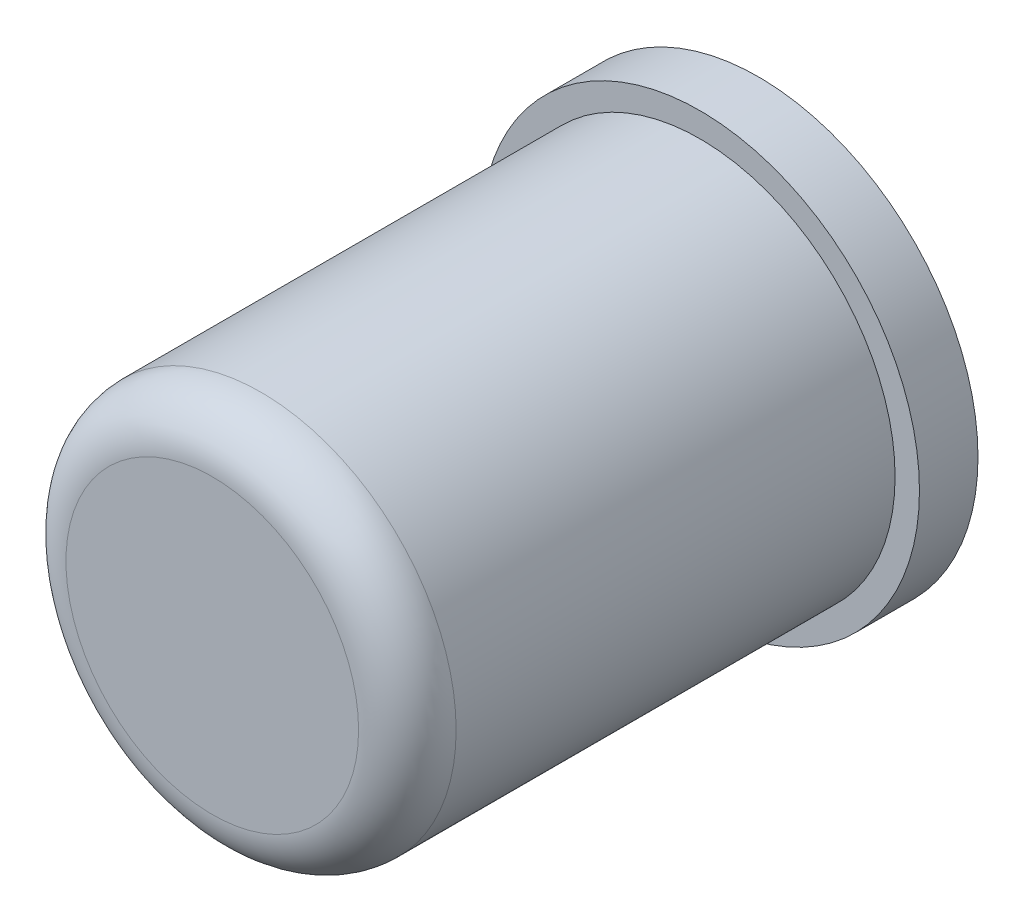
ISO-10303-21;
HEADER;
FILE_DESCRIPTION(('STEP AP214'),'2;1');
FILE_NAME('part.step','',(''),(''),'','','');
FILE_SCHEMA(('AUTOMOTIVE_DESIGN { 1 0 10303 214 1 1 1 1 }'));
ENDSEC;
DATA;
#1=APPLICATION_CONTEXT('core data for automotive mechanical design processes');
#2=APPLICATION_PROTOCOL_DEFINITION('international standard','automotive_design',2000,#1);
#3=PRODUCT_CONTEXT('',#1,'mechanical');
#4=PRODUCT('Part','Part','',(#3));
#5=PRODUCT_RELATED_PRODUCT_CATEGORY('part','',(#4));
#6=PRODUCT_DEFINITION_FORMATION('','',#4);
#7=PRODUCT_DEFINITION_CONTEXT('part definition',#1,'design');
#8=PRODUCT_DEFINITION('design','',#6,#7);
#9=PRODUCT_DEFINITION_SHAPE('','',#8);
#10=(LENGTH_UNIT() NAMED_UNIT(*) SI_UNIT(.MILLI.,.METRE.));
#11=(NAMED_UNIT(*) PLANE_ANGLE_UNIT() SI_UNIT($,.RADIAN.));
#12=(NAMED_UNIT(*) SI_UNIT($,.STERADIAN.) SOLID_ANGLE_UNIT());
#13=UNCERTAINTY_MEASURE_WITH_UNIT(LENGTH_MEASURE(1.E-05),#10,'distance_accuracy_value','');
#14=(GEOMETRIC_REPRESENTATION_CONTEXT(3) GLOBAL_UNCERTAINTY_ASSIGNED_CONTEXT((#13)) GLOBAL_UNIT_ASSIGNED_CONTEXT((#10,
#11,#12)) REPRESENTATION_CONTEXT('',''));
#15=CARTESIAN_POINT('',(0.,0.,0.));
#16=DIRECTION('',(0.,0.,1.));
#17=DIRECTION('',(1.,0.,0.));
#18=AXIS2_PLACEMENT_3D('',#15,#16,#17);
#19=CARTESIAN_POINT('',(0.,0.,1.2));
#20=DIRECTION('',(0.,0.,1.));
#21=DIRECTION('',(1.,0.,0.));
#22=AXIS2_PLACEMENT_3D('',#19,#20,#21);
#23=PLANE('',#22);
#24=CARTESIAN_POINT('',(0.,0.,1.2));
#25=DIRECTION('',(0.,0.,1.));
#26=DIRECTION('',(1.,0.,0.));
#27=AXIS2_PLACEMENT_3D('',#24,#25,#26);
#28=CIRCLE('',#27,4.5);
#29=CARTESIAN_POINT('',(4.5,0.,1.2));
#30=VERTEX_POINT('',#29);
#31=EDGE_CURVE('E44',#30,#30,#28,.T.);
#32=ORIENTED_EDGE('',*,*,#31,.T.);
#33=EDGE_LOOP('',(#32));
#34=FACE_BOUND('',#33,.T.);
#35=CARTESIAN_POINT('',(0.,0.,1.2));
#36=DIRECTION('',(0.,0.,1.));
#37=DIRECTION('',(1.,0.,0.));
#38=AXIS2_PLACEMENT_3D('',#35,#36,#37);
#39=CIRCLE('',#38,4.);
#40=CARTESIAN_POINT('',(4.,0.,1.2));
#41=VERTEX_POINT('',#40);
#42=EDGE_CURVE('E52',#41,#41,#39,.T.);
#43=ORIENTED_EDGE('',*,*,#42,.F.);
#44=EDGE_LOOP('',(#43));
#45=FACE_BOUND('',#44,.T.);
#46=ADVANCED_FACE('F33',(#34,#45),#23,.T.);
#47=CARTESIAN_POINT('',(0.,0.,1.2));
#48=DIRECTION('',(0.,0.,-1.));
#49=DIRECTION('',(-1.,0.,0.));
#50=AXIS2_PLACEMENT_3D('',#47,#48,#49);
#51=CYLINDRICAL_SURFACE('',#50,4.5);
#52=ORIENTED_EDGE('',*,*,#31,.F.);
#53=EDGE_LOOP('',(#52));
#54=FACE_BOUND('',#53,.T.);
#55=CARTESIAN_POINT('',(0.,0.,0.));
#56=DIRECTION('',(0.,0.,1.));
#57=DIRECTION('',(1.,0.,0.));
#58=AXIS2_PLACEMENT_3D('',#55,#56,#57);
#59=CIRCLE('',#58,4.5);
#60=CARTESIAN_POINT('',(4.5,0.,0.));
#61=VERTEX_POINT('',#60);
#62=EDGE_CURVE('E48',#61,#61,#59,.T.);
#63=ORIENTED_EDGE('',*,*,#62,.T.);
#64=EDGE_LOOP('',(#63));
#65=FACE_BOUND('',#64,.T.);
#66=ADVANCED_FACE('F60',(#54,#65),#51,.T.);
#67=CARTESIAN_POINT('',(0.,0.,0.));
#68=DIRECTION('',(0.,0.,1.));
#69=DIRECTION('',(1.,0.,0.));
#70=AXIS2_PLACEMENT_3D('',#67,#68,#69);
#71=PLANE('',#70);
#72=ORIENTED_EDGE('',*,*,#62,.F.);
#73=EDGE_LOOP('',(#72));
#74=FACE_BOUND('',#73,.T.);
#75=ADVANCED_FACE('F66',(#74),#71,.F.);
#76=CARTESIAN_POINT('',(0.,0.,11.2));
#77=DIRECTION('',(0.,0.,-1.));
#78=DIRECTION('',(-1.,0.,0.));
#79=AXIS2_PLACEMENT_3D('',#76,#77,#78);
#80=CYLINDRICAL_SURFACE('',#79,4.);
#81=CARTESIAN_POINT('',(0.,0.,10.2));
#82=DIRECTION('',(0.,0.,1.));
#83=DIRECTION('',(1.,0.,0.));
#84=AXIS2_PLACEMENT_3D('',#81,#82,#83);
#85=CIRCLE('',#84,4.);
#86=CARTESIAN_POINT('',(4.,0.,10.2));
#87=VERTEX_POINT('',#86);
#88=EDGE_CURVE('E10',#87,#87,#85,.F.);
#89=ORIENTED_EDGE('',*,*,#88,.T.);
#90=EDGE_LOOP('',(#89));
#91=FACE_BOUND('',#90,.T.);
#92=ORIENTED_EDGE('',*,*,#42,.T.);
#93=EDGE_LOOP('',(#92));
#94=FACE_BOUND('',#93,.T.);
#95=ADVANCED_FACE('F57',(#91,#94),#80,.T.);
#96=CARTESIAN_POINT('',(0.,0.,11.2));
#97=DIRECTION('',(0.,0.,1.));
#98=DIRECTION('',(1.,0.,0.));
#99=AXIS2_PLACEMENT_3D('',#96,#97,#98);
#100=PLANE('',#99);
#101=CARTESIAN_POINT('',(0.,0.,11.2));
#102=DIRECTION('',(0.,0.,1.));
#103=DIRECTION('',(1.,0.,0.));
#104=AXIS2_PLACEMENT_3D('',#101,#102,#103);
#105=CIRCLE('',#104,3.);
#106=CARTESIAN_POINT('',(3.,0.,11.2));
#107=VERTEX_POINT('',#106);
#108=EDGE_CURVE('E40',#107,#107,#105,.T.);
#109=ORIENTED_EDGE('',*,*,#108,.T.);
#110=EDGE_LOOP('',(#109));
#111=FACE_BOUND('',#110,.T.);
#112=ADVANCED_FACE('F76',(#111),#100,.T.);
#113=CARTESIAN_POINT('',(0.,0.,10.2));
#114=DIRECTION('',(0.,0.,1.));
#115=DIRECTION('',(1.,0.,0.));
#116=AXIS2_PLACEMENT_3D('',#113,#114,#115);
#117=TOROIDAL_SURFACE('',#116,3.,1.);
#118=ORIENTED_EDGE('',*,*,#88,.F.);
#119=EDGE_LOOP('',(#118));
#120=FACE_BOUND('',#119,.T.);
#121=ORIENTED_EDGE('',*,*,#108,.F.);
#122=EDGE_LOOP('',(#121));
#123=FACE_BOUND('',#122,.T.);
#124=ADVANCED_FACE('F35',(#120,#123),#117,.T.);
#125=CLOSED_SHELL('',(#46,#66,#75,#95,#112,#124));
#126=MANIFOLD_SOLID_BREP('B2',#125);
#127=ADVANCED_BREP_SHAPE_REPRESENTATION('',(#18,#126),#14);
#128=SHAPE_DEFINITION_REPRESENTATION(#9,#127);
ENDSEC;
END-ISO-10303-21;
